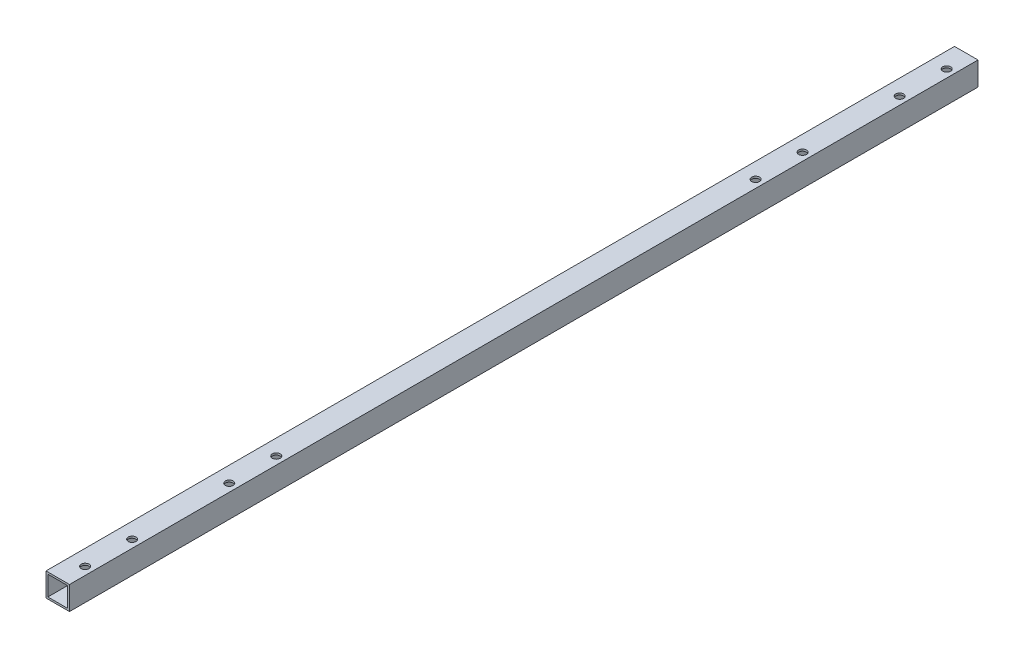
ISO-10303-21;
HEADER;
FILE_DESCRIPTION(('STEP AP214'),'2;1');
FILE_NAME('part.step','',(''),(''),'','','');
FILE_SCHEMA(('AUTOMOTIVE_DESIGN { 1 0 10303 214 1 1 1 1 }'));
ENDSEC;
DATA;
#1=APPLICATION_CONTEXT('core data for automotive mechanical design processes');
#2=APPLICATION_PROTOCOL_DEFINITION('international standard','automotive_design',2000,#1);
#3=PRODUCT_CONTEXT('',#1,'mechanical');
#4=PRODUCT('Part','Part','',(#3));
#5=PRODUCT_RELATED_PRODUCT_CATEGORY('part','',(#4));
#6=PRODUCT_DEFINITION_FORMATION('','',#4);
#7=PRODUCT_DEFINITION_CONTEXT('part definition',#1,'design');
#8=PRODUCT_DEFINITION('design','',#6,#7);
#9=PRODUCT_DEFINITION_SHAPE('','',#8);
#10=(LENGTH_UNIT() NAMED_UNIT(*) SI_UNIT(.MILLI.,.METRE.));
#11=(NAMED_UNIT(*) PLANE_ANGLE_UNIT() SI_UNIT($,.RADIAN.));
#12=(NAMED_UNIT(*) SI_UNIT($,.STERADIAN.) SOLID_ANGLE_UNIT());
#13=UNCERTAINTY_MEASURE_WITH_UNIT(LENGTH_MEASURE(1.E-05),#10,'distance_accuracy_value','');
#14=(GEOMETRIC_REPRESENTATION_CONTEXT(3) GLOBAL_UNCERTAINTY_ASSIGNED_CONTEXT((#13)) GLOBAL_UNIT_ASSIGNED_CONTEXT((#10,
#11,#12)) REPRESENTATION_CONTEXT('',''));
#15=CARTESIAN_POINT('',(0.,0.,0.));
#16=DIRECTION('',(0.,0.,1.));
#17=DIRECTION('',(1.,0.,0.));
#18=AXIS2_PLACEMENT_3D('',#15,#16,#17);
#19=CARTESIAN_POINT('',(0.,0.,0.));
#20=DIRECTION('',(0.,0.,-1.));
#21=DIRECTION('',(-1.,0.,0.));
#22=AXIS2_PLACEMENT_3D('',#19,#20,#21);
#23=PLANE('',#22);
#24=DIRECTION('',(0.,1.,0.));
#25=VECTOR('',#24,1.);
#26=CARTESIAN_POINT('',(7.5,-7.5,0.));
#27=LINE('',#26,#25);
#28=CARTESIAN_POINT('',(7.5,-7.5,0.));
#29=VERTEX_POINT('',#28);
#30=CARTESIAN_POINT('',(7.5,7.5,0.));
#31=VERTEX_POINT('',#30);
#32=EDGE_CURVE('E140',#29,#31,#27,.T.);
#33=ORIENTED_EDGE('',*,*,#32,.F.);
#34=DIRECTION('',(1.,0.,0.));
#35=VECTOR('',#34,1.);
#36=CARTESIAN_POINT('',(-7.5,-7.5,0.));
#37=LINE('',#36,#35);
#38=CARTESIAN_POINT('',(-7.5,-7.5,0.));
#39=VERTEX_POINT('',#38);
#40=EDGE_CURVE('E88',#39,#29,#37,.T.);
#41=ORIENTED_EDGE('',*,*,#40,.F.);
#42=DIRECTION('',(0.,-1.,0.));
#43=VECTOR('',#42,1.);
#44=CARTESIAN_POINT('',(-7.5,-7.5,0.));
#45=LINE('',#44,#43);
#46=CARTESIAN_POINT('',(-7.5,7.5,0.));
#47=VERTEX_POINT('',#46);
#48=EDGE_CURVE('E259',#47,#39,#45,.T.);
#49=ORIENTED_EDGE('',*,*,#48,.F.);
#50=DIRECTION('',(-1.,0.,0.));
#51=VECTOR('',#50,1.);
#52=CARTESIAN_POINT('',(-7.5,7.5,0.));
#53=LINE('',#52,#51);
#54=EDGE_CURVE('E256',#31,#47,#53,.T.);
#55=ORIENTED_EDGE('',*,*,#54,.F.);
#56=EDGE_LOOP('',(#33,#41,#49,#55));
#57=FACE_BOUND('',#56,.T.);
#58=DIRECTION('',(0.,-1.,0.));
#59=VECTOR('',#58,1.);
#60=CARTESIAN_POINT('',(-6.3,-6.3,0.));
#61=LINE('',#60,#59);
#62=CARTESIAN_POINT('',(-6.3,6.3,0.));
#63=VERTEX_POINT('',#62);
#64=CARTESIAN_POINT('',(-6.3,-6.3,0.));
#65=VERTEX_POINT('',#64);
#66=EDGE_CURVE('E242',#63,#65,#61,.T.);
#67=ORIENTED_EDGE('',*,*,#66,.T.);
#68=DIRECTION('',(1.,0.,0.));
#69=VECTOR('',#68,1.);
#70=CARTESIAN_POINT('',(-6.3,-6.3,0.));
#71=LINE('',#70,#69);
#72=CARTESIAN_POINT('',(6.3,-6.3,0.));
#73=VERTEX_POINT('',#72);
#74=EDGE_CURVE('E80',#65,#73,#71,.T.);
#75=ORIENTED_EDGE('',*,*,#74,.T.);
#76=DIRECTION('',(0.,1.,0.));
#77=VECTOR('',#76,1.);
#78=CARTESIAN_POINT('',(6.3,-6.3,0.));
#79=LINE('',#78,#77);
#80=CARTESIAN_POINT('',(6.3,6.3,0.));
#81=VERTEX_POINT('',#80);
#82=EDGE_CURVE('E138',#73,#81,#79,.T.);
#83=ORIENTED_EDGE('',*,*,#82,.T.);
#84=DIRECTION('',(-1.,0.,0.));
#85=VECTOR('',#84,1.);
#86=CARTESIAN_POINT('',(-6.3,6.3,0.));
#87=LINE('',#86,#85);
#88=EDGE_CURVE('E238',#81,#63,#87,.T.);
#89=ORIENTED_EDGE('',*,*,#88,.T.);
#90=EDGE_LOOP('',(#67,#75,#83,#89));
#91=FACE_BOUND('',#90,.T.);
#92=ADVANCED_FACE('F62',(#57,#91),#23,.T.);
#93=CARTESIAN_POINT('',(7.5,-7.5,570.));
#94=DIRECTION('',(-1.,0.,0.));
#95=DIRECTION('',(0.,0.,1.));
#96=AXIS2_PLACEMENT_3D('',#93,#94,#95);
#97=PLANE('',#96);
#98=ORIENTED_EDGE('',*,*,#32,.T.);
#99=DIRECTION('',(0.,0.,-1.));
#100=VECTOR('',#99,1.);
#101=CARTESIAN_POINT('',(7.5,7.5,570.));
#102=LINE('',#101,#100);
#103=CARTESIAN_POINT('',(7.5,7.5,580.));
#104=VERTEX_POINT('',#103);
#105=EDGE_CURVE('E12',#104,#31,#102,.T.);
#106=ORIENTED_EDGE('',*,*,#105,.F.);
#107=DIRECTION('',(0.,1.,0.));
#108=VECTOR('',#107,1.);
#109=CARTESIAN_POINT('',(7.5,-7.5,580.));
#110=LINE('',#109,#108);
#111=CARTESIAN_POINT('',(7.5,-7.5,580.));
#112=VERTEX_POINT('',#111);
#113=EDGE_CURVE('E178',#112,#104,#110,.T.);
#114=ORIENTED_EDGE('',*,*,#113,.F.);
#115=DIRECTION('',(0.,0.,-1.));
#116=VECTOR('',#115,1.);
#117=CARTESIAN_POINT('',(7.5,-7.5,570.));
#118=LINE('',#117,#116);
#119=EDGE_CURVE('E264',#112,#29,#118,.T.);
#120=ORIENTED_EDGE('',*,*,#119,.T.);
#121=EDGE_LOOP('',(#98,#106,#114,#120));
#122=FACE_BOUND('',#121,.T.);
#123=ADVANCED_FACE('F64',(#122),#97,.F.);
#124=CARTESIAN_POINT('',(-7.5,7.5,570.));
#125=DIRECTION('',(0.,-1.,0.));
#126=DIRECTION('',(0.,0.,-1.));
#127=AXIS2_PLACEMENT_3D('',#124,#125,#126);
#128=PLANE('',#127);
#129=CARTESIAN_POINT('',(2.49999999999994,7.5,44.9999999999999));
#130=DIRECTION('',(0.,-1.,0.));
#131=DIRECTION('',(0.,0.,-1.));
#132=AXIS2_PLACEMENT_3D('',#129,#130,#131);
#133=CIRCLE('',#132,2.5);
#134=CARTESIAN_POINT('',(2.49999999999994,7.5,42.4999999999999));
#135=VERTEX_POINT('',#134);
#136=EDGE_CURVE('E324',#135,#135,#133,.F.);
#137=ORIENTED_EDGE('',*,*,#136,.F.);
#138=EDGE_LOOP('',(#137));
#139=FACE_BOUND('',#138,.T.);
#140=CARTESIAN_POINT('',(2.49999999999994,7.5,107.));
#141=DIRECTION('',(0.,-1.,0.));
#142=DIRECTION('',(0.,0.,-1.));
#143=AXIS2_PLACEMENT_3D('',#140,#141,#142);
#144=CIRCLE('',#143,2.5);
#145=CARTESIAN_POINT('',(2.49999999999994,7.5,104.5));
#146=VERTEX_POINT('',#145);
#147=EDGE_CURVE('E306',#146,#146,#144,.F.);
#148=ORIENTED_EDGE('',*,*,#147,.F.);
#149=EDGE_LOOP('',(#148));
#150=FACE_BOUND('',#149,.T.);
#151=CARTESIAN_POINT('',(2.49999999999994,7.5,137.));
#152=DIRECTION('',(0.,-1.,0.));
#153=DIRECTION('',(0.,0.,-1.));
#154=AXIS2_PLACEMENT_3D('',#151,#152,#153);
#155=CIRCLE('',#154,2.5);
#156=CARTESIAN_POINT('',(2.49999999999994,7.5,134.5));
#157=VERTEX_POINT('',#156);
#158=EDGE_CURVE('E300',#157,#157,#155,.F.);
#159=ORIENTED_EDGE('',*,*,#158,.F.);
#160=EDGE_LOOP('',(#159));
#161=FACE_BOUND('',#160,.T.);
#162=CARTESIAN_POINT('',(2.49999999999994,7.5,14.9999999999999));
#163=DIRECTION('',(0.,-1.,0.));
#164=DIRECTION('',(0.,0.,-1.));
#165=AXIS2_PLACEMENT_3D('',#162,#163,#164);
#166=CIRCLE('',#165,2.5);
#167=CARTESIAN_POINT('',(2.49999999999994,7.5,12.4999999999999));
#168=VERTEX_POINT('',#167);
#169=EDGE_CURVE('E151',#168,#168,#166,.F.);
#170=ORIENTED_EDGE('',*,*,#169,.F.);
#171=EDGE_LOOP('',(#170));
#172=FACE_BOUND('',#171,.T.);
#173=CARTESIAN_POINT('',(2.49999999999994,7.5,535.));
#174=DIRECTION('',(0.,-1.,0.));
#175=DIRECTION('',(0.,0.,-1.));
#176=AXIS2_PLACEMENT_3D('',#173,#174,#175);
#177=CIRCLE('',#176,2.5);
#178=CARTESIAN_POINT('',(2.49999999999994,7.5,532.5));
#179=VERTEX_POINT('',#178);
#180=EDGE_CURVE('E217',#179,#179,#177,.T.);
#181=ORIENTED_EDGE('',*,*,#180,.T.);
#182=EDGE_LOOP('',(#181));
#183=FACE_BOUND('',#182,.T.);
#184=CARTESIAN_POINT('',(2.49999999999994,7.5,473.));
#185=DIRECTION('',(0.,-1.,0.));
#186=DIRECTION('',(0.,0.,-1.));
#187=AXIS2_PLACEMENT_3D('',#184,#185,#186);
#188=CIRCLE('',#187,2.5);
#189=CARTESIAN_POINT('',(2.49999999999994,7.5,470.5));
#190=VERTEX_POINT('',#189);
#191=EDGE_CURVE('E208',#190,#190,#188,.T.);
#192=ORIENTED_EDGE('',*,*,#191,.T.);
#193=EDGE_LOOP('',(#192));
#194=FACE_BOUND('',#193,.T.);
#195=CARTESIAN_POINT('',(2.49999999999994,7.5,443.));
#196=DIRECTION('',(0.,-1.,0.));
#197=DIRECTION('',(0.,0.,-1.));
#198=AXIS2_PLACEMENT_3D('',#195,#196,#197);
#199=CIRCLE('',#198,2.5);
#200=CARTESIAN_POINT('',(2.49999999999994,7.5,440.5));
#201=VERTEX_POINT('',#200);
#202=EDGE_CURVE('E199',#201,#201,#199,.T.);
#203=ORIENTED_EDGE('',*,*,#202,.T.);
#204=EDGE_LOOP('',(#203));
#205=FACE_BOUND('',#204,.T.);
#206=CARTESIAN_POINT('',(2.49999999999994,7.5,565.));
#207=DIRECTION('',(0.,-1.,0.));
#208=DIRECTION('',(0.,0.,-1.));
#209=AXIS2_PLACEMENT_3D('',#206,#207,#208);
#210=CIRCLE('',#209,2.5);
#211=CARTESIAN_POINT('',(2.49999999999994,7.5,562.5));
#212=VERTEX_POINT('',#211);
#213=EDGE_CURVE('E230',#212,#212,#210,.T.);
#214=ORIENTED_EDGE('',*,*,#213,.T.);
#215=EDGE_LOOP('',(#214));
#216=FACE_BOUND('',#215,.T.);
#217=ORIENTED_EDGE('',*,*,#54,.T.);
#218=DIRECTION('',(0.,0.,-1.));
#219=VECTOR('',#218,1.);
#220=CARTESIAN_POINT('',(-7.5,7.5,570.));
#221=LINE('',#220,#219);
#222=CARTESIAN_POINT('',(-7.5,7.5,580.));
#223=VERTEX_POINT('',#222);
#224=EDGE_CURVE('E72',#223,#47,#221,.T.);
#225=ORIENTED_EDGE('',*,*,#224,.F.);
#226=DIRECTION('',(-1.,0.,0.));
#227=VECTOR('',#226,1.);
#228=CARTESIAN_POINT('',(7.5,7.5,580.));
#229=LINE('',#228,#227);
#230=EDGE_CURVE('E166',#104,#223,#229,.T.);
#231=ORIENTED_EDGE('',*,*,#230,.F.);
#232=ORIENTED_EDGE('',*,*,#105,.T.);
#233=EDGE_LOOP('',(#217,#225,#231,#232));
#234=FACE_BOUND('',#233,.T.);
#235=ADVANCED_FACE('F339',(#139,#150,#161,#172,#183,#194,#205,#216,#234),#128,.F.);
#236=CARTESIAN_POINT('',(-7.5,-7.5,570.));
#237=DIRECTION('',(1.,0.,0.));
#238=DIRECTION('',(0.,0.,-1.));
#239=AXIS2_PLACEMENT_3D('',#236,#237,#238);
#240=PLANE('',#239);
#241=ORIENTED_EDGE('',*,*,#48,.T.);
#242=DIRECTION('',(0.,0.,-1.));
#243=VECTOR('',#242,1.);
#244=CARTESIAN_POINT('',(-7.5,-7.5,570.));
#245=LINE('',#244,#243);
#246=CARTESIAN_POINT('',(-7.5,-7.5,580.));
#247=VERTEX_POINT('',#246);
#248=EDGE_CURVE('E267',#247,#39,#245,.T.);
#249=ORIENTED_EDGE('',*,*,#248,.F.);
#250=DIRECTION('',(0.,-1.,0.));
#251=VECTOR('',#250,1.);
#252=CARTESIAN_POINT('',(-7.5,7.5,580.));
#253=LINE('',#252,#251);
#254=EDGE_CURVE('E170',#223,#247,#253,.T.);
#255=ORIENTED_EDGE('',*,*,#254,.F.);
#256=ORIENTED_EDGE('',*,*,#224,.T.);
#257=EDGE_LOOP('',(#241,#249,#255,#256));
#258=FACE_BOUND('',#257,.T.);
#259=ADVANCED_FACE('F342',(#258),#240,.F.);
#260=CARTESIAN_POINT('',(-7.5,-7.5,570.));
#261=DIRECTION('',(0.,1.,0.));
#262=DIRECTION('',(0.,0.,1.));
#263=AXIS2_PLACEMENT_3D('',#260,#261,#262);
#264=PLANE('',#263);
#265=CARTESIAN_POINT('',(2.49999999999994,-7.5,44.9999999999999));
#266=DIRECTION('',(0.,1.,0.));
#267=DIRECTION('',(0.,0.,1.));
#268=AXIS2_PLACEMENT_3D('',#265,#266,#267);
#269=CIRCLE('',#268,2.5);
#270=CARTESIAN_POINT('',(2.49999999999994,-7.5,47.4999999999999));
#271=VERTEX_POINT('',#270);
#272=EDGE_CURVE('E295',#271,#271,#269,.T.);
#273=ORIENTED_EDGE('',*,*,#272,.T.);
#274=EDGE_LOOP('',(#273));
#275=FACE_BOUND('',#274,.T.);
#276=CARTESIAN_POINT('',(2.49999999999994,-7.5,107.));
#277=DIRECTION('',(0.,1.,0.));
#278=DIRECTION('',(0.,0.,1.));
#279=AXIS2_PLACEMENT_3D('',#276,#277,#278);
#280=CIRCLE('',#279,2.5);
#281=CARTESIAN_POINT('',(2.49999999999994,-7.5,109.5));
#282=VERTEX_POINT('',#281);
#283=EDGE_CURVE('E629',#282,#282,#280,.T.);
#284=ORIENTED_EDGE('',*,*,#283,.T.);
#285=EDGE_LOOP('',(#284));
#286=FACE_BOUND('',#285,.T.);
#287=CARTESIAN_POINT('',(2.49999999999994,-7.5,137.));
#288=DIRECTION('',(0.,1.,0.));
#289=DIRECTION('',(0.,0.,1.));
#290=AXIS2_PLACEMENT_3D('',#287,#288,#289);
#291=CIRCLE('',#290,2.5);
#292=CARTESIAN_POINT('',(2.49999999999994,-7.5,139.5));
#293=VERTEX_POINT('',#292);
#294=EDGE_CURVE('E633',#293,#293,#291,.T.);
#295=ORIENTED_EDGE('',*,*,#294,.T.);
#296=EDGE_LOOP('',(#295));
#297=FACE_BOUND('',#296,.T.);
#298=CARTESIAN_POINT('',(2.49999999999994,-7.5,14.9999999999999));
#299=DIRECTION('',(0.,1.,0.));
#300=DIRECTION('',(0.,0.,1.));
#301=AXIS2_PLACEMENT_3D('',#298,#299,#300);
#302=CIRCLE('',#301,2.5);
#303=CARTESIAN_POINT('',(2.49999999999994,-7.5,17.4999999999999));
#304=VERTEX_POINT('',#303);
#305=EDGE_CURVE('E290',#304,#304,#302,.T.);
#306=ORIENTED_EDGE('',*,*,#305,.T.);
#307=EDGE_LOOP('',(#306));
#308=FACE_BOUND('',#307,.T.);
#309=CARTESIAN_POINT('',(2.49999999999994,-7.5,535.));
#310=DIRECTION('',(0.,-1.,0.));
#311=DIRECTION('',(0.,0.,-1.));
#312=AXIS2_PLACEMENT_3D('',#309,#310,#311);
#313=CIRCLE('',#312,2.5);
#314=CARTESIAN_POINT('',(2.49999999999994,-7.5,532.5));
#315=VERTEX_POINT('',#314);
#316=EDGE_CURVE('E183',#315,#315,#313,.T.);
#317=ORIENTED_EDGE('',*,*,#316,.F.);
#318=EDGE_LOOP('',(#317));
#319=FACE_BOUND('',#318,.T.);
#320=CARTESIAN_POINT('',(2.49999999999994,-7.5,473.));
#321=DIRECTION('',(0.,-1.,0.));
#322=DIRECTION('',(0.,0.,-1.));
#323=AXIS2_PLACEMENT_3D('',#320,#321,#322);
#324=CIRCLE('',#323,2.5);
#325=CARTESIAN_POINT('',(2.49999999999994,-7.5,470.5));
#326=VERTEX_POINT('',#325);
#327=EDGE_CURVE('E188',#326,#326,#324,.T.);
#328=ORIENTED_EDGE('',*,*,#327,.F.);
#329=EDGE_LOOP('',(#328));
#330=FACE_BOUND('',#329,.T.);
#331=CARTESIAN_POINT('',(2.49999999999994,-7.5,443.));
#332=DIRECTION('',(0.,-1.,0.));
#333=DIRECTION('',(0.,0.,-1.));
#334=AXIS2_PLACEMENT_3D('',#331,#332,#333);
#335=CIRCLE('',#334,2.5);
#336=CARTESIAN_POINT('',(2.49999999999994,-7.5,440.5));
#337=VERTEX_POINT('',#336);
#338=EDGE_CURVE('E182',#337,#337,#335,.T.);
#339=ORIENTED_EDGE('',*,*,#338,.F.);
#340=EDGE_LOOP('',(#339));
#341=FACE_BOUND('',#340,.T.);
#342=CARTESIAN_POINT('',(2.49999999999994,-7.5,565.));
#343=DIRECTION('',(0.,-1.,0.));
#344=DIRECTION('',(0.,0.,-1.));
#345=AXIS2_PLACEMENT_3D('',#342,#343,#344);
#346=CIRCLE('',#345,2.5);
#347=CARTESIAN_POINT('',(2.49999999999994,-7.5,562.5));
#348=VERTEX_POINT('',#347);
#349=EDGE_CURVE('E221',#348,#348,#346,.T.);
#350=ORIENTED_EDGE('',*,*,#349,.F.);
#351=EDGE_LOOP('',(#350));
#352=FACE_BOUND('',#351,.T.);
#353=ORIENTED_EDGE('',*,*,#40,.T.);
#354=ORIENTED_EDGE('',*,*,#119,.F.);
#355=DIRECTION('',(1.,0.,0.));
#356=VECTOR('',#355,1.);
#357=CARTESIAN_POINT('',(-7.5,-7.5,580.));
#358=LINE('',#357,#356);
#359=EDGE_CURVE('E174',#247,#112,#358,.T.);
#360=ORIENTED_EDGE('',*,*,#359,.F.);
#361=ORIENTED_EDGE('',*,*,#248,.T.);
#362=EDGE_LOOP('',(#353,#354,#360,#361));
#363=FACE_BOUND('',#362,.T.);
#364=ADVANCED_FACE('F362',(#275,#286,#297,#308,#319,#330,#341,#352,#363),#264,.F.);
#365=CARTESIAN_POINT('',(-6.3,-6.3,570.));
#366=DIRECTION('',(0.,1.,0.));
#367=DIRECTION('',(0.,0.,1.));
#368=AXIS2_PLACEMENT_3D('',#365,#366,#367);
#369=PLANE('',#368);
#370=CARTESIAN_POINT('',(2.49999999999994,-6.3,44.9999999999999));
#371=DIRECTION('',(0.,1.,0.));
#372=DIRECTION('',(0.,0.,1.));
#373=AXIS2_PLACEMENT_3D('',#370,#371,#372);
#374=CIRCLE('',#373,2.5);
#375=CARTESIAN_POINT('',(2.49999999999994,-6.3,47.4999999999999));
#376=VERTEX_POINT('',#375);
#377=EDGE_CURVE('E320',#376,#376,#374,.F.);
#378=ORIENTED_EDGE('',*,*,#377,.T.);
#379=EDGE_LOOP('',(#378));
#380=FACE_BOUND('',#379,.T.);
#381=CARTESIAN_POINT('',(2.49999999999994,-6.3,107.));
#382=DIRECTION('',(0.,1.,0.));
#383=DIRECTION('',(0.,0.,1.));
#384=AXIS2_PLACEMENT_3D('',#381,#382,#383);
#385=CIRCLE('',#384,2.5);
#386=CARTESIAN_POINT('',(2.49999999999994,-6.3,109.5));
#387=VERTEX_POINT('',#386);
#388=EDGE_CURVE('E299',#387,#387,#385,.F.);
#389=ORIENTED_EDGE('',*,*,#388,.T.);
#390=EDGE_LOOP('',(#389));
#391=FACE_BOUND('',#390,.T.);
#392=CARTESIAN_POINT('',(2.49999999999994,-6.3,137.));
#393=DIRECTION('',(0.,1.,0.));
#394=DIRECTION('',(0.,0.,1.));
#395=AXIS2_PLACEMENT_3D('',#392,#393,#394);
#396=CIRCLE('',#395,2.5);
#397=CARTESIAN_POINT('',(2.49999999999994,-6.3,139.5));
#398=VERTEX_POINT('',#397);
#399=EDGE_CURVE('E294',#398,#398,#396,.F.);
#400=ORIENTED_EDGE('',*,*,#399,.T.);
#401=EDGE_LOOP('',(#400));
#402=FACE_BOUND('',#401,.T.);
#403=CARTESIAN_POINT('',(2.49999999999994,-6.3,14.9999999999999));
#404=DIRECTION('',(0.,1.,0.));
#405=DIRECTION('',(0.,0.,1.));
#406=AXIS2_PLACEMENT_3D('',#403,#404,#405);
#407=CIRCLE('',#406,2.5);
#408=CARTESIAN_POINT('',(2.49999999999994,-6.3,17.4999999999999));
#409=VERTEX_POINT('',#408);
#410=EDGE_CURVE('E289',#409,#409,#407,.F.);
#411=ORIENTED_EDGE('',*,*,#410,.T.);
#412=EDGE_LOOP('',(#411));
#413=FACE_BOUND('',#412,.T.);
#414=CARTESIAN_POINT('',(2.49999999999994,-6.3,535.));
#415=DIRECTION('',(0.,1.,0.));
#416=DIRECTION('',(0.,0.,1.));
#417=AXIS2_PLACEMENT_3D('',#414,#415,#416);
#418=CIRCLE('',#417,2.5);
#419=CARTESIAN_POINT('',(2.49999999999994,-6.3,537.5));
#420=VERTEX_POINT('',#419);
#421=EDGE_CURVE('E213',#420,#420,#418,.T.);
#422=ORIENTED_EDGE('',*,*,#421,.F.);
#423=EDGE_LOOP('',(#422));
#424=FACE_BOUND('',#423,.T.);
#425=CARTESIAN_POINT('',(2.49999999999994,-6.3,473.));
#426=DIRECTION('',(0.,1.,0.));
#427=DIRECTION('',(0.,0.,1.));
#428=AXIS2_PLACEMENT_3D('',#425,#426,#427);
#429=CIRCLE('',#428,2.5);
#430=CARTESIAN_POINT('',(2.49999999999994,-6.3,475.5));
#431=VERTEX_POINT('',#430);
#432=EDGE_CURVE('E204',#431,#431,#429,.T.);
#433=ORIENTED_EDGE('',*,*,#432,.F.);
#434=EDGE_LOOP('',(#433));
#435=FACE_BOUND('',#434,.T.);
#436=CARTESIAN_POINT('',(2.49999999999994,-6.3,443.));
#437=DIRECTION('',(0.,1.,0.));
#438=DIRECTION('',(0.,0.,1.));
#439=AXIS2_PLACEMENT_3D('',#436,#437,#438);
#440=CIRCLE('',#439,2.5);
#441=CARTESIAN_POINT('',(2.49999999999994,-6.3,445.5));
#442=VERTEX_POINT('',#441);
#443=EDGE_CURVE('E195',#442,#442,#440,.T.);
#444=ORIENTED_EDGE('',*,*,#443,.F.);
#445=EDGE_LOOP('',(#444));
#446=FACE_BOUND('',#445,.T.);
#447=CARTESIAN_POINT('',(2.49999999999994,-6.3,565.));
#448=DIRECTION('',(0.,1.,0.));
#449=DIRECTION('',(0.,0.,1.));
#450=AXIS2_PLACEMENT_3D('',#447,#448,#449);
#451=CIRCLE('',#450,2.5);
#452=CARTESIAN_POINT('',(2.49999999999994,-6.3,567.5));
#453=VERTEX_POINT('',#452);
#454=EDGE_CURVE('E226',#453,#453,#451,.T.);
#455=ORIENTED_EDGE('',*,*,#454,.F.);
#456=EDGE_LOOP('',(#455));
#457=FACE_BOUND('',#456,.T.);
#458=ORIENTED_EDGE('',*,*,#74,.F.);
#459=DIRECTION('',(0.,0.,-1.));
#460=VECTOR('',#459,1.);
#461=CARTESIAN_POINT('',(-6.3,-6.3,570.));
#462=LINE('',#461,#460);
#463=CARTESIAN_POINT('',(-6.3,-6.3,580.));
#464=VERTEX_POINT('',#463);
#465=EDGE_CURVE('E146',#464,#65,#462,.T.);
#466=ORIENTED_EDGE('',*,*,#465,.F.);
#467=DIRECTION('',(-1.,0.,0.));
#468=VECTOR('',#467,1.);
#469=CARTESIAN_POINT('',(0.,-6.3,580.));
#470=LINE('',#469,#468);
#471=CARTESIAN_POINT('',(6.3,-6.3,580.));
#472=VERTEX_POINT('',#471);
#473=EDGE_CURVE('E144',#472,#464,#470,.T.);
#474=ORIENTED_EDGE('',*,*,#473,.F.);
#475=DIRECTION('',(0.,0.,-1.));
#476=VECTOR('',#475,1.);
#477=CARTESIAN_POINT('',(6.3,-6.3,570.));
#478=LINE('',#477,#476);
#479=EDGE_CURVE('E131',#472,#73,#478,.T.);
#480=ORIENTED_EDGE('',*,*,#479,.T.);
#481=EDGE_LOOP('',(#458,#466,#474,#480));
#482=FACE_BOUND('',#481,.T.);
#483=ADVANCED_FACE('F145',(#380,#391,#402,#413,#424,#435,#446,#457,#482),#369,.T.);
#484=CARTESIAN_POINT('',(6.3,-6.3,570.));
#485=DIRECTION('',(-1.,0.,0.));
#486=DIRECTION('',(0.,0.,1.));
#487=AXIS2_PLACEMENT_3D('',#484,#485,#486);
#488=PLANE('',#487);
#489=ORIENTED_EDGE('',*,*,#82,.F.);
#490=ORIENTED_EDGE('',*,*,#479,.F.);
#491=DIRECTION('',(0.,-1.,0.));
#492=VECTOR('',#491,1.);
#493=CARTESIAN_POINT('',(6.3,0.,580.));
#494=LINE('',#493,#492);
#495=CARTESIAN_POINT('',(6.3,6.3,580.));
#496=VERTEX_POINT('',#495);
#497=EDGE_CURVE('E135',#496,#472,#494,.T.);
#498=ORIENTED_EDGE('',*,*,#497,.F.);
#499=DIRECTION('',(0.,0.,-1.));
#500=VECTOR('',#499,1.);
#501=CARTESIAN_POINT('',(6.3,6.3,570.));
#502=LINE('',#501,#500);
#503=EDGE_CURVE('E141',#496,#81,#502,.T.);
#504=ORIENTED_EDGE('',*,*,#503,.T.);
#505=EDGE_LOOP('',(#489,#490,#498,#504));
#506=FACE_BOUND('',#505,.T.);
#507=ADVANCED_FACE('F133',(#506),#488,.T.);
#508=CARTESIAN_POINT('',(-6.3,6.3,570.));
#509=DIRECTION('',(0.,-1.,0.));
#510=DIRECTION('',(0.,0.,-1.));
#511=AXIS2_PLACEMENT_3D('',#508,#509,#510);
#512=PLANE('',#511);
#513=CARTESIAN_POINT('',(2.49999999999994,6.3,44.9999999999999));
#514=DIRECTION('',(0.,-1.,0.));
#515=DIRECTION('',(0.,0.,-1.));
#516=AXIS2_PLACEMENT_3D('',#513,#514,#515);
#517=CIRCLE('',#516,2.5);
#518=CARTESIAN_POINT('',(2.49999999999994,6.3,42.4999999999999));
#519=VERTEX_POINT('',#518);
#520=EDGE_CURVE('E66',#519,#519,#517,.F.);
#521=ORIENTED_EDGE('',*,*,#520,.T.);
#522=EDGE_LOOP('',(#521));
#523=FACE_BOUND('',#522,.T.);
#524=CARTESIAN_POINT('',(2.49999999999994,6.3,107.));
#525=DIRECTION('',(0.,-1.,0.));
#526=DIRECTION('',(0.,0.,-1.));
#527=AXIS2_PLACEMENT_3D('',#524,#525,#526);
#528=CIRCLE('',#527,2.5);
#529=CARTESIAN_POINT('',(2.49999999999994,6.3,104.5));
#530=VERTEX_POINT('',#529);
#531=EDGE_CURVE('E296',#530,#530,#528,.F.);
#532=ORIENTED_EDGE('',*,*,#531,.T.);
#533=EDGE_LOOP('',(#532));
#534=FACE_BOUND('',#533,.T.);
#535=CARTESIAN_POINT('',(2.49999999999994,6.3,137.));
#536=DIRECTION('',(0.,-1.,0.));
#537=DIRECTION('',(0.,0.,-1.));
#538=AXIS2_PLACEMENT_3D('',#535,#536,#537);
#539=CIRCLE('',#538,2.5);
#540=CARTESIAN_POINT('',(2.49999999999994,6.3,134.5));
#541=VERTEX_POINT('',#540);
#542=EDGE_CURVE('E291',#541,#541,#539,.F.);
#543=ORIENTED_EDGE('',*,*,#542,.T.);
#544=EDGE_LOOP('',(#543));
#545=FACE_BOUND('',#544,.T.);
#546=CARTESIAN_POINT('',(2.49999999999994,6.3,14.9999999999999));
#547=DIRECTION('',(0.,-1.,0.));
#548=DIRECTION('',(0.,0.,-1.));
#549=AXIS2_PLACEMENT_3D('',#546,#547,#548);
#550=CIRCLE('',#549,2.5);
#551=CARTESIAN_POINT('',(2.49999999999994,6.3,12.4999999999999));
#552=VERTEX_POINT('',#551);
#553=EDGE_CURVE('E285',#552,#552,#550,.F.);
#554=ORIENTED_EDGE('',*,*,#553,.T.);
#555=EDGE_LOOP('',(#554));
#556=FACE_BOUND('',#555,.T.);
#557=CARTESIAN_POINT('',(2.49999999999994,6.3,535.));
#558=DIRECTION('',(0.,-1.,0.));
#559=DIRECTION('',(0.,0.,-1.));
#560=AXIS2_PLACEMENT_3D('',#557,#558,#559);
#561=CIRCLE('',#560,2.5);
#562=CARTESIAN_POINT('',(2.49999999999994,6.3,532.5));
#563=VERTEX_POINT('',#562);
#564=EDGE_CURVE('E212',#563,#563,#561,.T.);
#565=ORIENTED_EDGE('',*,*,#564,.F.);
#566=EDGE_LOOP('',(#565));
#567=FACE_BOUND('',#566,.T.);
#568=CARTESIAN_POINT('',(2.49999999999994,6.3,473.));
#569=DIRECTION('',(0.,-1.,0.));
#570=DIRECTION('',(0.,0.,-1.));
#571=AXIS2_PLACEMENT_3D('',#568,#569,#570);
#572=CIRCLE('',#571,2.5);
#573=CARTESIAN_POINT('',(2.49999999999994,6.3,470.5));
#574=VERTEX_POINT('',#573);
#575=EDGE_CURVE('E203',#574,#574,#572,.T.);
#576=ORIENTED_EDGE('',*,*,#575,.F.);
#577=EDGE_LOOP('',(#576));
#578=FACE_BOUND('',#577,.T.);
#579=CARTESIAN_POINT('',(2.49999999999994,6.3,443.));
#580=DIRECTION('',(0.,-1.,0.));
#581=DIRECTION('',(0.,0.,-1.));
#582=AXIS2_PLACEMENT_3D('',#579,#580,#581);
#583=CIRCLE('',#582,2.5);
#584=CARTESIAN_POINT('',(2.49999999999994,6.3,440.5));
#585=VERTEX_POINT('',#584);
#586=EDGE_CURVE('E187',#585,#585,#583,.T.);
#587=ORIENTED_EDGE('',*,*,#586,.F.);
#588=EDGE_LOOP('',(#587));
#589=FACE_BOUND('',#588,.T.);
#590=CARTESIAN_POINT('',(2.49999999999994,6.3,565.));
#591=DIRECTION('',(0.,-1.,0.));
#592=DIRECTION('',(0.,0.,-1.));
#593=AXIS2_PLACEMENT_3D('',#590,#591,#592);
#594=CIRCLE('',#593,2.5);
#595=CARTESIAN_POINT('',(2.49999999999994,6.3,562.5));
#596=VERTEX_POINT('',#595);
#597=EDGE_CURVE('E225',#596,#596,#594,.T.);
#598=ORIENTED_EDGE('',*,*,#597,.F.);
#599=EDGE_LOOP('',(#598));
#600=FACE_BOUND('',#599,.T.);
#601=ORIENTED_EDGE('',*,*,#88,.F.);
#602=ORIENTED_EDGE('',*,*,#503,.F.);
#603=DIRECTION('',(1.,0.,0.));
#604=VECTOR('',#603,1.);
#605=CARTESIAN_POINT('',(0.,6.3,580.));
#606=LINE('',#605,#604);
#607=CARTESIAN_POINT('',(-6.3,6.3,580.));
#608=VERTEX_POINT('',#607);
#609=EDGE_CURVE('E156',#608,#496,#606,.T.);
#610=ORIENTED_EDGE('',*,*,#609,.F.);
#611=DIRECTION('',(0.,0.,-1.));
#612=VECTOR('',#611,1.);
#613=CARTESIAN_POINT('',(-6.3,6.3,570.));
#614=LINE('',#613,#612);
#615=EDGE_CURVE('E248',#608,#63,#614,.T.);
#616=ORIENTED_EDGE('',*,*,#615,.T.);
#617=EDGE_LOOP('',(#601,#602,#610,#616));
#618=FACE_BOUND('',#617,.T.);
#619=ADVANCED_FACE('F419',(#523,#534,#545,#556,#567,#578,#589,#600,#618),#512,.T.);
#620=CARTESIAN_POINT('',(-6.3,-6.3,570.));
#621=DIRECTION('',(1.,0.,0.));
#622=DIRECTION('',(0.,0.,-1.));
#623=AXIS2_PLACEMENT_3D('',#620,#621,#622);
#624=PLANE('',#623);
#625=ORIENTED_EDGE('',*,*,#66,.F.);
#626=ORIENTED_EDGE('',*,*,#615,.F.);
#627=DIRECTION('',(0.,1.,0.));
#628=VECTOR('',#627,1.);
#629=CARTESIAN_POINT('',(-6.3,0.,580.));
#630=LINE('',#629,#628);
#631=EDGE_CURVE('E160',#464,#608,#630,.T.);
#632=ORIENTED_EDGE('',*,*,#631,.F.);
#633=ORIENTED_EDGE('',*,*,#465,.T.);
#634=EDGE_LOOP('',(#625,#626,#632,#633));
#635=FACE_BOUND('',#634,.T.);
#636=ADVANCED_FACE('F426',(#635),#624,.T.);
#637=CARTESIAN_POINT('',(2.49999999999994,17.5,565.));
#638=DIRECTION('',(0.,-1.,0.));
#639=DIRECTION('',(0.,0.,-1.));
#640=AXIS2_PLACEMENT_3D('',#637,#638,#639);
#641=CYLINDRICAL_SURFACE('',#640,2.5);
#642=ORIENTED_EDGE('',*,*,#597,.T.);
#643=EDGE_LOOP('',(#642));
#644=FACE_BOUND('',#643,.T.);
#645=ORIENTED_EDGE('',*,*,#213,.F.);
#646=EDGE_LOOP('',(#645));
#647=FACE_BOUND('',#646,.T.);
#648=ADVANCED_FACE('F437',(#644,#647),#641,.F.);
#649=ORIENTED_EDGE('',*,*,#454,.T.);
#650=EDGE_LOOP('',(#649));
#651=FACE_BOUND('',#650,.T.);
#652=ORIENTED_EDGE('',*,*,#349,.T.);
#653=EDGE_LOOP('',(#652));
#654=FACE_BOUND('',#653,.T.);
#655=ADVANCED_FACE('F444',(#651,#654),#641,.F.);
#656=CARTESIAN_POINT('',(2.49999999999994,17.5,443.));
#657=DIRECTION('',(0.,-1.,0.));
#658=DIRECTION('',(0.,0.,-1.));
#659=AXIS2_PLACEMENT_3D('',#656,#657,#658);
#660=CYLINDRICAL_SURFACE('',#659,2.5);
#661=ORIENTED_EDGE('',*,*,#586,.T.);
#662=EDGE_LOOP('',(#661));
#663=FACE_BOUND('',#662,.T.);
#664=ORIENTED_EDGE('',*,*,#202,.F.);
#665=EDGE_LOOP('',(#664));
#666=FACE_BOUND('',#665,.T.);
#667=ADVANCED_FACE('F452',(#663,#666),#660,.F.);
#668=CARTESIAN_POINT('',(2.49999999999994,17.5,473.));
#669=DIRECTION('',(0.,-1.,0.));
#670=DIRECTION('',(0.,0.,-1.));
#671=AXIS2_PLACEMENT_3D('',#668,#669,#670);
#672=CYLINDRICAL_SURFACE('',#671,2.5);
#673=ORIENTED_EDGE('',*,*,#575,.T.);
#674=EDGE_LOOP('',(#673));
#675=FACE_BOUND('',#674,.T.);
#676=ORIENTED_EDGE('',*,*,#191,.F.);
#677=EDGE_LOOP('',(#676));
#678=FACE_BOUND('',#677,.T.);
#679=ADVANCED_FACE('F459',(#675,#678),#672,.F.);
#680=CARTESIAN_POINT('',(2.49999999999994,17.5,535.));
#681=DIRECTION('',(0.,-1.,0.));
#682=DIRECTION('',(0.,0.,-1.));
#683=AXIS2_PLACEMENT_3D('',#680,#681,#682);
#684=CYLINDRICAL_SURFACE('',#683,2.5);
#685=ORIENTED_EDGE('',*,*,#564,.T.);
#686=EDGE_LOOP('',(#685));
#687=FACE_BOUND('',#686,.T.);
#688=ORIENTED_EDGE('',*,*,#180,.F.);
#689=EDGE_LOOP('',(#688));
#690=FACE_BOUND('',#689,.T.);
#691=ADVANCED_FACE('F376',(#687,#690),#684,.F.);
#692=ORIENTED_EDGE('',*,*,#443,.T.);
#693=EDGE_LOOP('',(#692));
#694=FACE_BOUND('',#693,.T.);
#695=ORIENTED_EDGE('',*,*,#338,.T.);
#696=EDGE_LOOP('',(#695));
#697=FACE_BOUND('',#696,.T.);
#698=ADVANCED_FACE('F462',(#694,#697),#660,.F.);
#699=ORIENTED_EDGE('',*,*,#432,.T.);
#700=EDGE_LOOP('',(#699));
#701=FACE_BOUND('',#700,.T.);
#702=ORIENTED_EDGE('',*,*,#327,.T.);
#703=EDGE_LOOP('',(#702));
#704=FACE_BOUND('',#703,.T.);
#705=ADVANCED_FACE('F373',(#701,#704),#672,.F.);
#706=ORIENTED_EDGE('',*,*,#421,.T.);
#707=EDGE_LOOP('',(#706));
#708=FACE_BOUND('',#707,.T.);
#709=ORIENTED_EDGE('',*,*,#316,.T.);
#710=EDGE_LOOP('',(#709));
#711=FACE_BOUND('',#710,.T.);
#712=ADVANCED_FACE('F364',(#708,#711),#684,.F.);
#713=CARTESIAN_POINT('',(0.,0.,580.));
#714=DIRECTION('',(0.,0.,1.));
#715=DIRECTION('',(1.,0.,0.));
#716=AXIS2_PLACEMENT_3D('',#713,#714,#715);
#717=PLANE('',#716);
#718=ORIENTED_EDGE('',*,*,#473,.T.);
#719=ORIENTED_EDGE('',*,*,#631,.T.);
#720=ORIENTED_EDGE('',*,*,#609,.T.);
#721=ORIENTED_EDGE('',*,*,#497,.T.);
#722=EDGE_LOOP('',(#718,#719,#720,#721));
#723=FACE_BOUND('',#722,.T.);
#724=ORIENTED_EDGE('',*,*,#230,.T.);
#725=ORIENTED_EDGE('',*,*,#254,.T.);
#726=ORIENTED_EDGE('',*,*,#359,.T.);
#727=ORIENTED_EDGE('',*,*,#113,.T.);
#728=EDGE_LOOP('',(#724,#725,#726,#727));
#729=FACE_BOUND('',#728,.T.);
#730=ADVANCED_FACE('F153',(#723,#729),#717,.T.);
#731=CARTESIAN_POINT('',(2.49999999999994,17.5,14.9999999999999));
#732=DIRECTION('',(0.,-1.,0.));
#733=DIRECTION('',(0.,0.,-1.));
#734=AXIS2_PLACEMENT_3D('',#731,#732,#733);
#735=CYLINDRICAL_SURFACE('',#734,2.5);
#736=ORIENTED_EDGE('',*,*,#553,.F.);
#737=EDGE_LOOP('',(#736));
#738=FACE_BOUND('',#737,.T.);
#739=ORIENTED_EDGE('',*,*,#169,.T.);
#740=EDGE_LOOP('',(#739));
#741=FACE_BOUND('',#740,.T.);
#742=ADVANCED_FACE('F337',(#738,#741),#735,.F.);
#743=ORIENTED_EDGE('',*,*,#410,.F.);
#744=EDGE_LOOP('',(#743));
#745=FACE_BOUND('',#744,.T.);
#746=ORIENTED_EDGE('',*,*,#305,.F.);
#747=EDGE_LOOP('',(#746));
#748=FACE_BOUND('',#747,.T.);
#749=ADVANCED_FACE('F370',(#745,#748),#735,.F.);
#750=CARTESIAN_POINT('',(2.49999999999994,17.5,137.));
#751=DIRECTION('',(0.,-1.,0.));
#752=DIRECTION('',(0.,0.,-1.));
#753=AXIS2_PLACEMENT_3D('',#750,#751,#752);
#754=CYLINDRICAL_SURFACE('',#753,2.5);
#755=ORIENTED_EDGE('',*,*,#542,.F.);
#756=EDGE_LOOP('',(#755));
#757=FACE_BOUND('',#756,.T.);
#758=ORIENTED_EDGE('',*,*,#158,.T.);
#759=EDGE_LOOP('',(#758));
#760=FACE_BOUND('',#759,.T.);
#761=ADVANCED_FACE('F564',(#757,#760),#754,.F.);
#762=CARTESIAN_POINT('',(2.49999999999994,17.5,107.));
#763=DIRECTION('',(0.,-1.,0.));
#764=DIRECTION('',(0.,0.,-1.));
#765=AXIS2_PLACEMENT_3D('',#762,#763,#764);
#766=CYLINDRICAL_SURFACE('',#765,2.5);
#767=ORIENTED_EDGE('',*,*,#531,.F.);
#768=EDGE_LOOP('',(#767));
#769=FACE_BOUND('',#768,.T.);
#770=ORIENTED_EDGE('',*,*,#147,.T.);
#771=EDGE_LOOP('',(#770));
#772=FACE_BOUND('',#771,.T.);
#773=ADVANCED_FACE('F572',(#769,#772),#766,.F.);
#774=CARTESIAN_POINT('',(2.49999999999994,17.5,44.9999999999999));
#775=DIRECTION('',(0.,-1.,0.));
#776=DIRECTION('',(0.,0.,-1.));
#777=AXIS2_PLACEMENT_3D('',#774,#775,#776);
#778=CYLINDRICAL_SURFACE('',#777,2.5);
#779=ORIENTED_EDGE('',*,*,#520,.F.);
#780=EDGE_LOOP('',(#779));
#781=FACE_BOUND('',#780,.T.);
#782=ORIENTED_EDGE('',*,*,#136,.T.);
#783=EDGE_LOOP('',(#782));
#784=FACE_BOUND('',#783,.T.);
#785=ADVANCED_FACE('F582',(#781,#784),#778,.F.);
#786=ORIENTED_EDGE('',*,*,#399,.F.);
#787=EDGE_LOOP('',(#786));
#788=FACE_BOUND('',#787,.T.);
#789=ORIENTED_EDGE('',*,*,#294,.F.);
#790=EDGE_LOOP('',(#789));
#791=FACE_BOUND('',#790,.T.);
#792=ADVANCED_FACE('F575',(#788,#791),#754,.F.);
#793=ORIENTED_EDGE('',*,*,#388,.F.);
#794=EDGE_LOOP('',(#793));
#795=FACE_BOUND('',#794,.T.);
#796=ORIENTED_EDGE('',*,*,#283,.F.);
#797=EDGE_LOOP('',(#796));
#798=FACE_BOUND('',#797,.T.);
#799=ADVANCED_FACE('F585',(#795,#798),#766,.F.);
#800=ORIENTED_EDGE('',*,*,#377,.F.);
#801=EDGE_LOOP('',(#800));
#802=FACE_BOUND('',#801,.T.);
#803=ORIENTED_EDGE('',*,*,#272,.F.);
#804=EDGE_LOOP('',(#803));
#805=FACE_BOUND('',#804,.T.);
#806=ADVANCED_FACE('F594',(#802,#805),#778,.F.);
#807=CLOSED_SHELL('',(#92,#123,#235,#259,#364,#483,#507,#619,#636,#648,#655,#667,#679,#691,#698,
#705,#712,#730,#742,#749,#761,#773,#785,#792,#799,#806));
#808=MANIFOLD_SOLID_BREP('B2',#807);
#809=ADVANCED_BREP_SHAPE_REPRESENTATION('',(#18,#808),#14);
#810=SHAPE_DEFINITION_REPRESENTATION(#9,#809);
ENDSEC;
END-ISO-10303-21;
